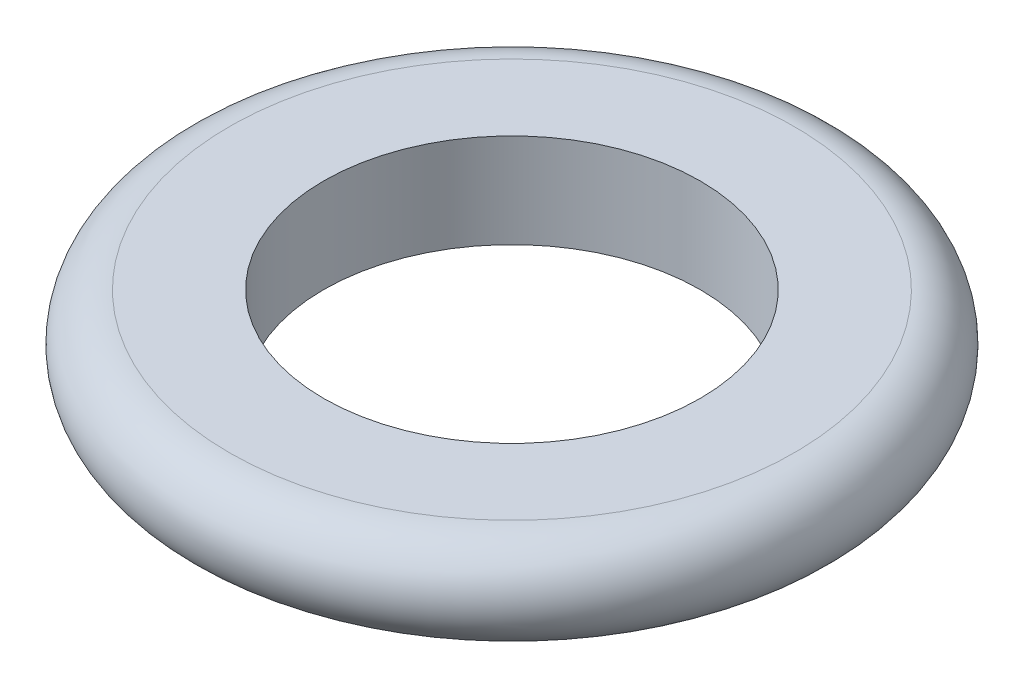
ISO-10303-21;
HEADER;
FILE_DESCRIPTION(('STEP AP214'),'2;1');
FILE_NAME('part.step','',(''),(''),'','','');
FILE_SCHEMA(('AUTOMOTIVE_DESIGN { 1 0 10303 214 1 1 1 1 }'));
ENDSEC;
DATA;
#1=APPLICATION_CONTEXT('core data for automotive mechanical design processes');
#2=APPLICATION_PROTOCOL_DEFINITION('international standard','automotive_design',2000,#1);
#3=PRODUCT_CONTEXT('',#1,'mechanical');
#4=PRODUCT('Part','Part','',(#3));
#5=PRODUCT_RELATED_PRODUCT_CATEGORY('part','',(#4));
#6=PRODUCT_DEFINITION_FORMATION('','',#4);
#7=PRODUCT_DEFINITION_CONTEXT('part definition',#1,'design');
#8=PRODUCT_DEFINITION('design','',#6,#7);
#9=PRODUCT_DEFINITION_SHAPE('','',#8);
#10=(LENGTH_UNIT() NAMED_UNIT(*) SI_UNIT(.MILLI.,.METRE.));
#11=(NAMED_UNIT(*) PLANE_ANGLE_UNIT() SI_UNIT($,.RADIAN.));
#12=(NAMED_UNIT(*) SI_UNIT($,.STERADIAN.) SOLID_ANGLE_UNIT());
#13=UNCERTAINTY_MEASURE_WITH_UNIT(LENGTH_MEASURE(1.E-05),#10,'distance_accuracy_value','');
#14=(GEOMETRIC_REPRESENTATION_CONTEXT(3) GLOBAL_UNCERTAINTY_ASSIGNED_CONTEXT((#13)) GLOBAL_UNIT_ASSIGNED_CONTEXT((#10,
#11,#12)) REPRESENTATION_CONTEXT('',''));
#15=CARTESIAN_POINT('',(0.,0.,0.));
#16=DIRECTION('',(0.,0.,1.));
#17=DIRECTION('',(1.,0.,0.));
#18=AXIS2_PLACEMENT_3D('',#15,#16,#17);
#19=CARTESIAN_POINT('',(0.,3.,0.));
#20=DIRECTION('',(0.,-1.,0.));
#21=DIRECTION('',(0.,0.,-1.));
#22=AXIS2_PLACEMENT_3D('',#19,#20,#21);
#23=PLANE('',#22);
#24=CARTESIAN_POINT('',(0.,3.,0.));
#25=DIRECTION('',(0.,1.,0.));
#26=DIRECTION('',(0.,0.,1.));
#27=AXIS2_PLACEMENT_3D('',#24,#25,#26);
#28=CIRCLE('',#27,4.);
#29=CARTESIAN_POINT('',(0.,3.,4.));
#30=VERTEX_POINT('',#29);
#31=EDGE_CURVE('E53',#30,#30,#28,.T.);
#32=ORIENTED_EDGE('',*,*,#31,.F.);
#33=EDGE_LOOP('',(#32));
#34=FACE_BOUND('',#33,.T.);
#35=CARTESIAN_POINT('',(0.,3.,0.));
#36=DIRECTION('',(0.,1.,0.));
#37=DIRECTION('',(0.,0.,1.));
#38=AXIS2_PLACEMENT_3D('',#35,#36,#37);
#39=CIRCLE('',#38,6.);
#40=CARTESIAN_POINT('',(0.,3.,6.));
#41=VERTEX_POINT('',#40);
#42=EDGE_CURVE('E10',#41,#41,#39,.T.);
#43=ORIENTED_EDGE('',*,*,#42,.T.);
#44=EDGE_LOOP('',(#43));
#45=FACE_BOUND('',#44,.T.);
#46=ADVANCED_FACE('F39',(#34,#45),#23,.F.);
#47=CARTESIAN_POINT('',(0.,2.,0.));
#48=DIRECTION('',(0.,1.,0.));
#49=DIRECTION('',(0.,0.,1.));
#50=AXIS2_PLACEMENT_3D('',#47,#48,#49);
#51=TOROIDAL_SURFACE('',#50,6.,1.);
#52=CARTESIAN_POINT('',(0.,1.,0.));
#53=DIRECTION('',(0.,1.,0.));
#54=DIRECTION('',(0.,0.,1.));
#55=AXIS2_PLACEMENT_3D('',#52,#53,#54);
#56=CIRCLE('',#55,6.);
#57=CARTESIAN_POINT('',(0.,1.,6.));
#58=VERTEX_POINT('',#57);
#59=EDGE_CURVE('E45',#58,#58,#56,.T.);
#60=ORIENTED_EDGE('',*,*,#59,.T.);
#61=EDGE_LOOP('',(#60));
#62=FACE_BOUND('',#61,.T.);
#63=ORIENTED_EDGE('',*,*,#42,.F.);
#64=EDGE_LOOP('',(#63));
#65=FACE_BOUND('',#64,.T.);
#66=ADVANCED_FACE('F62',(#62,#65),#51,.T.);
#67=CARTESIAN_POINT('',(0.,1.,0.));
#68=DIRECTION('',(0.,1.,0.));
#69=DIRECTION('',(0.,0.,1.));
#70=AXIS2_PLACEMENT_3D('',#67,#68,#69);
#71=PLANE('',#70);
#72=ORIENTED_EDGE('',*,*,#59,.F.);
#73=EDGE_LOOP('',(#72));
#74=FACE_BOUND('',#73,.T.);
#75=CARTESIAN_POINT('',(0.,1.,0.));
#76=DIRECTION('',(0.,1.,0.));
#77=DIRECTION('',(0.,0.,1.));
#78=AXIS2_PLACEMENT_3D('',#75,#76,#77);
#79=CIRCLE('',#78,4.);
#80=CARTESIAN_POINT('',(0.,1.,4.));
#81=VERTEX_POINT('',#80);
#82=EDGE_CURVE('E49',#81,#81,#79,.T.);
#83=ORIENTED_EDGE('',*,*,#82,.T.);
#84=EDGE_LOOP('',(#83));
#85=FACE_BOUND('',#84,.T.);
#86=ADVANCED_FACE('F66',(#74,#85),#71,.F.);
#87=CARTESIAN_POINT('',(0.,3.51181102362205,0.));
#88=DIRECTION('',(0.,1.,0.));
#89=DIRECTION('',(0.,0.,1.));
#90=AXIS2_PLACEMENT_3D('',#87,#88,#89);
#91=CYLINDRICAL_SURFACE('',#90,4.);
#92=ORIENTED_EDGE('',*,*,#82,.F.);
#93=EDGE_LOOP('',(#92));
#94=FACE_BOUND('',#93,.T.);
#95=ORIENTED_EDGE('',*,*,#31,.T.);
#96=EDGE_LOOP('',(#95));
#97=FACE_BOUND('',#96,.T.);
#98=ADVANCED_FACE('F59',(#94,#97),#91,.F.);
#99=CLOSED_SHELL('',(#46,#66,#86,#98));
#100=MANIFOLD_SOLID_BREP('B2',#99);
#101=ADVANCED_BREP_SHAPE_REPRESENTATION('',(#18,#100),#14);
#102=SHAPE_DEFINITION_REPRESENTATION(#9,#101);
ENDSEC;
END-ISO-10303-21;
